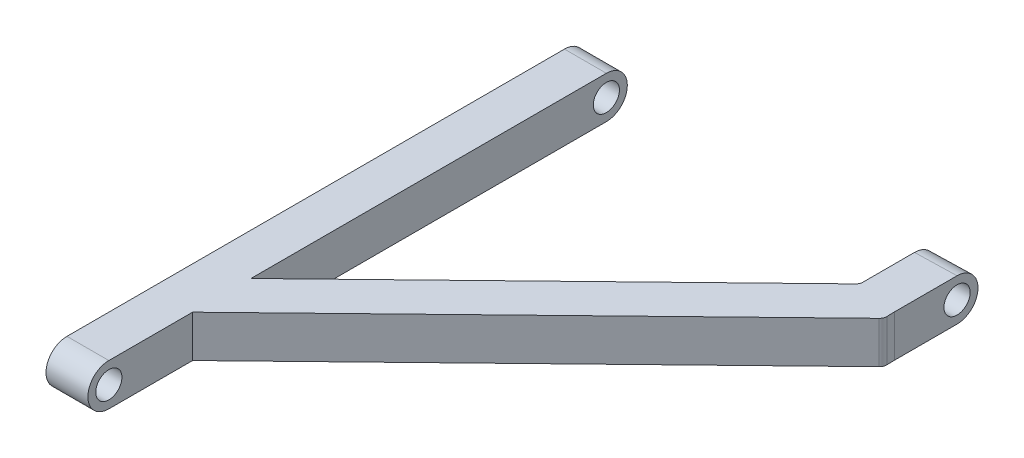
ISO-10303-21;
HEADER;
FILE_DESCRIPTION(('STEP AP214'),'2;1');
FILE_NAME('part.step','',(''),(''),'','','');
FILE_SCHEMA(('AUTOMOTIVE_DESIGN { 1 0 10303 214 1 1 1 1 }'));
ENDSEC;
DATA;
#1=APPLICATION_CONTEXT('core data for automotive mechanical design processes');
#2=APPLICATION_PROTOCOL_DEFINITION('international standard','automotive_design',2000,#1);
#3=PRODUCT_CONTEXT('',#1,'mechanical');
#4=PRODUCT('Part','Part','',(#3));
#5=PRODUCT_RELATED_PRODUCT_CATEGORY('part','',(#4));
#6=PRODUCT_DEFINITION_FORMATION('','',#4);
#7=PRODUCT_DEFINITION_CONTEXT('part definition',#1,'design');
#8=PRODUCT_DEFINITION('design','',#6,#7);
#9=PRODUCT_DEFINITION_SHAPE('','',#8);
#10=(LENGTH_UNIT() NAMED_UNIT(*) SI_UNIT(.MILLI.,.METRE.));
#11=(NAMED_UNIT(*) PLANE_ANGLE_UNIT() SI_UNIT($,.RADIAN.));
#12=(NAMED_UNIT(*) SI_UNIT($,.STERADIAN.) SOLID_ANGLE_UNIT());
#13=UNCERTAINTY_MEASURE_WITH_UNIT(LENGTH_MEASURE(1.E-05),#10,'distance_accuracy_value','');
#14=(GEOMETRIC_REPRESENTATION_CONTEXT(3) GLOBAL_UNCERTAINTY_ASSIGNED_CONTEXT((#13)) GLOBAL_UNIT_ASSIGNED_CONTEXT((#10,
#11,#12)) REPRESENTATION_CONTEXT('',''));
#15=CARTESIAN_POINT('',(0.,0.,0.));
#16=DIRECTION('',(0.,0.,1.));
#17=DIRECTION('',(1.,0.,0.));
#18=AXIS2_PLACEMENT_3D('',#15,#16,#17);
#19=CARTESIAN_POINT('',(335.193923386663,-20.0000000000004,-462.022456718937));
#20=DIRECTION('',(-1.,0.,0.));
#21=DIRECTION('',(0.,0.,1.));
#22=AXIS2_PLACEMENT_3D('',#19,#20,#21);
#23=PLANE('',#22);
#24=DIRECTION('',(0.,0.,1.));
#25=VECTOR('',#24,1.);
#26=CARTESIAN_POINT('',(335.193923386663,19.9999999999996,-462.022456718937));
#27=LINE('',#26,#25);
#28=CARTESIAN_POINT('',(335.193923386663,19.9999999999997,-473.985718581626));
#29=VERTEX_POINT('',#28);
#30=CARTESIAN_POINT('',(335.193923386663,19.9999999999997,-424.789203993548));
#31=VERTEX_POINT('',#30);
#32=EDGE_CURVE('E190',#29,#31,#27,.T.);
#33=ORIENTED_EDGE('',*,*,#32,.F.);
#34=CARTESIAN_POINT('',(335.193923386663,-3.38538015855128E-13,-473.985718581626));
#35=DIRECTION('',(-1.,0.,0.));
#36=DIRECTION('',(0.,0.,1.));
#37=AXIS2_PLACEMENT_3D('',#34,#35,#36);
#38=ELLIPSE('',#37,20.006471869853,20.);
#39=CARTESIAN_POINT('',(335.193923386663,-20.0000000000004,-473.985718581626));
#40=VERTEX_POINT('',#39);
#41=EDGE_CURVE('E177',#29,#40,#38,.T.);
#42=ORIENTED_EDGE('',*,*,#41,.T.);
#43=DIRECTION('',(0.,0.,1.));
#44=VECTOR('',#43,1.);
#45=CARTESIAN_POINT('',(335.193923386663,-20.0000000000004,-495.));
#46=LINE('',#45,#44);
#47=CARTESIAN_POINT('',(335.193923386663,-20.0000000000003,-424.789203993548));
#48=VERTEX_POINT('',#47);
#49=EDGE_CURVE('E336',#40,#48,#46,.T.);
#50=ORIENTED_EDGE('',*,*,#49,.T.);
#51=DIRECTION('',(0.,1.,0.));
#52=VECTOR('',#51,1.);
#53=CARTESIAN_POINT('',(335.193923386663,-20.0000000000003,-424.789203993548));
#54=LINE('',#53,#52);
#55=EDGE_CURVE('E199',#48,#31,#54,.T.);
#56=ORIENTED_EDGE('',*,*,#55,.T.);
#57=EDGE_LOOP('',(#33,#42,#50,#56));
#58=FACE_BOUND('',#57,.T.);
#59=CARTESIAN_POINT('',(335.193923386663,-3.38538015855128E-13,-473.985718581626));
#60=DIRECTION('',(-1.,0.,0.));
#61=DIRECTION('',(0.,0.,1.));
#62=AXIS2_PLACEMENT_3D('',#59,#60,#61);
#63=ELLIPSE('',#62,12.5040449186581,12.5);
#64=CARTESIAN_POINT('',(335.193923386663,-3.3195324311871E-13,-461.481673662968));
#65=VERTEX_POINT('',#64);
#66=EDGE_CURVE('E349',#65,#65,#63,.F.);
#67=ORIENTED_EDGE('',*,*,#66,.T.);
#68=EDGE_LOOP('',(#67));
#69=FACE_BOUND('',#68,.T.);
#70=ADVANCED_FACE('F83',(#58,#69),#23,.T.);
#71=CARTESIAN_POINT('',(374.806076613337,-20.0000000000004,-495.));
#72=DIRECTION('',(1.,0.,0.));
#73=DIRECTION('',(0.,0.,-1.));
#74=AXIS2_PLACEMENT_3D('',#71,#72,#73);
#75=PLANE('',#74);
#76=DIRECTION('',(0.,0.,-1.));
#77=VECTOR('',#76,1.);
#78=CARTESIAN_POINT('',(374.806076613337,-20.0000000000004,-495.));
#79=LINE('',#78,#77);
#80=CARTESIAN_POINT('',(374.806076613337,-20.0000000000003,-415.181628683137));
#81=VERTEX_POINT('',#80);
#82=CARTESIAN_POINT('',(374.806076613337,-20.0000000000004,-474.993528130147));
#83=VERTEX_POINT('',#82);
#84=EDGE_CURVE('E339',#81,#83,#79,.T.);
#85=ORIENTED_EDGE('',*,*,#84,.T.);
#86=CARTESIAN_POINT('',(374.806076613337,-3.39068739863381E-13,-474.993528130147));
#87=DIRECTION('',(1.,0.,0.));
#88=DIRECTION('',(0.,0.,1.));
#89=AXIS2_PLACEMENT_3D('',#86,#87,#88);
#90=ELLIPSE('',#89,20.006471869853,20.);
#91=CARTESIAN_POINT('',(374.806076613337,19.9999999999996,-474.993528130147));
#92=VERTEX_POINT('',#91);
#93=EDGE_CURVE('E12',#83,#92,#90,.T.);
#94=ORIENTED_EDGE('',*,*,#93,.T.);
#95=DIRECTION('',(0.,0.,-1.));
#96=VECTOR('',#95,1.);
#97=CARTESIAN_POINT('',(374.806076613337,19.9999999999996,-495.));
#98=LINE('',#97,#96);
#99=CARTESIAN_POINT('',(374.806076613337,19.9999999999997,-415.181628683137));
#100=VERTEX_POINT('',#99);
#101=EDGE_CURVE('E194',#100,#92,#98,.T.);
#102=ORIENTED_EDGE('',*,*,#101,.F.);
#103=DIRECTION('',(0.,1.,0.));
#104=VECTOR('',#103,1.);
#105=CARTESIAN_POINT('',(374.806076613337,-20.0000000000003,-415.181628683137));
#106=LINE('',#105,#104);
#107=EDGE_CURVE('E233',#81,#100,#106,.T.);
#108=ORIENTED_EDGE('',*,*,#107,.F.);
#109=EDGE_LOOP('',(#85,#94,#102,#108));
#110=FACE_BOUND('',#109,.T.);
#111=CARTESIAN_POINT('',(374.806076613337,-3.39068739863381E-13,-474.993528130147));
#112=DIRECTION('',(1.,0.,0.));
#113=DIRECTION('',(0.,0.,1.));
#114=AXIS2_PLACEMENT_3D('',#111,#112,#113);
#115=ELLIPSE('',#114,12.5040449186581,12.5);
#116=CARTESIAN_POINT('',(374.806076613337,-3.32483967126962E-13,-462.489483211489));
#117=VERTEX_POINT('',#116);
#118=EDGE_CURVE('E87',#117,#117,#115,.F.);
#119=ORIENTED_EDGE('',*,*,#118,.T.);
#120=EDGE_LOOP('',(#119));
#121=FACE_BOUND('',#120,.T.);
#122=ADVANCED_FACE('F361',(#110,#121),#75,.T.);
#123=CARTESIAN_POINT('',(40.,0.,0.));
#124=DIRECTION('',(1.,0.,0.));
#125=DIRECTION('',(0.,0.,-1.));
#126=AXIS2_PLACEMENT_3D('',#123,#124,#125);
#127=PLANE('',#126);
#128=CARTESIAN_POINT('',(40.,0.,0.));
#129=DIRECTION('',(1.,0.,0.));
#130=DIRECTION('',(0.,0.,-1.));
#131=AXIS2_PLACEMENT_3D('',#128,#129,#130);
#132=CIRCLE('',#131,12.5);
#133=CARTESIAN_POINT('',(40.,0.,-12.5));
#134=VERTEX_POINT('',#133);
#135=EDGE_CURVE('E254',#134,#134,#132,.T.);
#136=ORIENTED_EDGE('',*,*,#135,.F.);
#137=EDGE_LOOP('',(#136));
#138=FACE_BOUND('',#137,.T.);
#139=DIRECTION('',(0.,0.,1.));
#140=VECTOR('',#139,1.);
#141=CARTESIAN_POINT('',(40.,-19.9999999999999,0.));
#142=LINE('',#141,#140);
#143=CARTESIAN_POINT('',(40.,-20.0000000000002,-80.));
#144=VERTEX_POINT('',#143);
#145=CARTESIAN_POINT('',(40.,-20.,0.));
#146=VERTEX_POINT('',#145);
#147=EDGE_CURVE('E245',#144,#146,#142,.T.);
#148=ORIENTED_EDGE('',*,*,#147,.F.);
#149=DIRECTION('',(0.,1.,0.));
#150=VECTOR('',#149,1.);
#151=CARTESIAN_POINT('',(40.,-20.0000000000002,-80.));
#152=LINE('',#151,#150);
#153=CARTESIAN_POINT('',(40.,19.9999999999999,-80.));
#154=VERTEX_POINT('',#153);
#155=EDGE_CURVE('E222',#144,#154,#152,.T.);
#156=ORIENTED_EDGE('',*,*,#155,.T.);
#157=DIRECTION('',(0.,0.,1.));
#158=VECTOR('',#157,1.);
#159=CARTESIAN_POINT('',(40.,19.9999999999999,0.));
#160=LINE('',#159,#158);
#161=CARTESIAN_POINT('',(40.,20.,0.));
#162=VERTEX_POINT('',#161);
#163=EDGE_CURVE('E244',#154,#162,#160,.T.);
#164=ORIENTED_EDGE('',*,*,#163,.T.);
#165=CARTESIAN_POINT('',(40.,0.,0.));
#166=DIRECTION('',(1.,0.,0.));
#167=DIRECTION('',(0.,0.,-1.));
#168=AXIS2_PLACEMENT_3D('',#165,#166,#167);
#169=CIRCLE('',#168,20.);
#170=EDGE_CURVE('E250',#162,#146,#169,.T.);
#171=ORIENTED_EDGE('',*,*,#170,.T.);
#172=EDGE_LOOP('',(#148,#156,#164,#171));
#173=FACE_BOUND('',#172,.T.);
#174=ADVANCED_FACE('F379',(#138,#173),#127,.T.);
#175=CARTESIAN_POINT('',(40.,-19.9999999999999,0.));
#176=DIRECTION('',(0.,-1.,0.));
#177=DIRECTION('',(0.,0.,-1.));
#178=AXIS2_PLACEMENT_3D('',#175,#176,#177);
#179=PLANE('',#178);
#180=DIRECTION('',(-0.999676511186225,0.,0.0254336977755314));
#181=VECTOR('',#180,1.);
#182=CARTESIAN_POINT('',(418.270773946204,-20.0000000000003,-476.099353828259));
#183=LINE('',#182,#181);
#184=EDGE_CURVE('E180',#83,#40,#183,.T.);
#185=ORIENTED_EDGE('',*,*,#184,.F.);
#186=ORIENTED_EDGE('',*,*,#84,.F.);
#187=DIRECTION('',(-0.0254336977755314,0.,-0.999676511186225));
#188=VECTOR('',#187,1.);
#189=CARTESIAN_POINT('',(374.806076613337,-20.0000000000003,-415.181628683137));
#190=LINE('',#189,#188);
#191=CARTESIAN_POINT('',(374.992889327505,-20.0000000000003,-407.838918079536));
#192=VERTEX_POINT('',#191);
#193=EDGE_CURVE('E357',#192,#81,#190,.T.);
#194=ORIENTED_EDGE('',*,*,#193,.F.);
#195=CARTESIAN_POINT('',(368.014348913388,-20.0000000000003,-407.661370557092));
#196=DIRECTION('',(0.,1.,0.));
#197=DIRECTION('',(0.,0.,1.));
#198=AXIS2_PLACEMENT_3D('',#195,#196,#197);
#199=CIRCLE('',#198,6.98079862438376);
#200=CARTESIAN_POINT('',(372.872939005298,-20.0000000000003,-402.648821130602));
#201=VERTEX_POINT('',#200);
#202=EDGE_CURVE('E217',#201,#192,#199,.T.);
#203=ORIENTED_EDGE('',*,*,#202,.F.);
#204=DIRECTION('',(0.718048134060329,0.,-0.695993446213741));
#205=VECTOR('',#204,1.);
#206=CARTESIAN_POINT('',(40.,-20.0000000000002,-80.));
#207=LINE('',#206,#205);
#208=EDGE_CURVE('E239',#144,#201,#207,.T.);
#209=ORIENTED_EDGE('',*,*,#208,.F.);
#210=ORIENTED_EDGE('',*,*,#147,.T.);
#211=DIRECTION('',(-1.,0.,0.));
#212=VECTOR('',#211,1.);
#213=CARTESIAN_POINT('',(40.,-20.,0.));
#214=LINE('',#213,#212);
#215=CARTESIAN_POINT('',(0.,-20.,0.));
#216=VERTEX_POINT('',#215);
#217=EDGE_CURVE('E258',#146,#216,#214,.T.);
#218=ORIENTED_EDGE('',*,*,#217,.T.);
#219=DIRECTION('',(0.,0.,1.));
#220=VECTOR('',#219,1.);
#221=CARTESIAN_POINT('',(0.,-19.9999999999999,0.));
#222=LINE('',#221,#220);
#223=CARTESIAN_POINT('',(0.,-20.,-475.));
#224=VERTEX_POINT('',#223);
#225=EDGE_CURVE('E259',#224,#216,#222,.T.);
#226=ORIENTED_EDGE('',*,*,#225,.F.);
#227=DIRECTION('',(-1.,0.,0.));
#228=VECTOR('',#227,1.);
#229=CARTESIAN_POINT('',(40.,-20.,-475.));
#230=LINE('',#229,#228);
#231=CARTESIAN_POINT('',(40.,-20.,-475.));
#232=VERTEX_POINT('',#231);
#233=EDGE_CURVE('E93',#232,#224,#230,.T.);
#234=ORIENTED_EDGE('',*,*,#233,.F.);
#235=CARTESIAN_POINT('',(40.,-20.0000000000002,-135.706571889287));
#236=VERTEX_POINT('',#235);
#237=EDGE_CURVE('E240',#232,#236,#142,.T.);
#238=ORIENTED_EDGE('',*,*,#237,.T.);
#239=DIRECTION('',(-0.718048134060329,0.,0.695993446213741));
#240=VECTOR('',#239,1.);
#241=CARTESIAN_POINT('',(40.,-20.0000000000002,-135.706571889287));
#242=LINE('',#241,#240);
#243=CARTESIAN_POINT('',(333.071714854189,-20.0000000000003,-419.776654567059));
#244=VERTEX_POINT('',#243);
#245=EDGE_CURVE('E326',#244,#236,#242,.T.);
#246=ORIENTED_EDGE('',*,*,#245,.F.);
#247=CARTESIAN_POINT('',(328.21312476228,-20.0000000000003,-424.789203993548));
#248=DIRECTION('',(0.,-1.,0.));
#249=DIRECTION('',(0.,0.,1.));
#250=AXIS2_PLACEMENT_3D('',#247,#248,#249);
#251=CIRCLE('',#250,6.9807986243832);
#252=EDGE_CURVE('E328',#48,#244,#251,.T.);
#253=ORIENTED_EDGE('',*,*,#252,.F.);
#254=ORIENTED_EDGE('',*,*,#49,.F.);
#255=EDGE_LOOP('',(#185,#186,#194,#203,#209,#210,#218,#226,#234,#238,#246,#253,#254));
#256=FACE_BOUND('',#255,.T.);
#257=ADVANCED_FACE('F308',(#256),#179,.T.);
#258=CARTESIAN_POINT('',(40.,19.9999999999999,0.));
#259=DIRECTION('',(0.,-1.,0.));
#260=DIRECTION('',(0.,0.,-1.));
#261=AXIS2_PLACEMENT_3D('',#258,#259,#260);
#262=PLANE('',#261);
#263=ORIENTED_EDGE('',*,*,#101,.T.);
#264=DIRECTION('',(-0.999676511186225,0.,0.0254336977755314));
#265=VECTOR('',#264,1.);
#266=CARTESIAN_POINT('',(418.270773946204,19.9999999999997,-476.099353828259));
#267=LINE('',#266,#265);
#268=EDGE_CURVE('E100',#92,#29,#267,.T.);
#269=ORIENTED_EDGE('',*,*,#268,.T.);
#270=ORIENTED_EDGE('',*,*,#32,.T.);
#271=CARTESIAN_POINT('',(328.21312476228,19.9999999999997,-424.789203993548));
#272=DIRECTION('',(0.,-1.,0.));
#273=DIRECTION('',(0.,0.,1.));
#274=AXIS2_PLACEMENT_3D('',#271,#272,#273);
#275=CIRCLE('',#274,6.9807986243832);
#276=CARTESIAN_POINT('',(333.071714854189,19.9999999999997,-419.776654567059));
#277=VERTEX_POINT('',#276);
#278=EDGE_CURVE('E202',#31,#277,#275,.T.);
#279=ORIENTED_EDGE('',*,*,#278,.T.);
#280=DIRECTION('',(-0.718048134060329,0.,0.695993446213741));
#281=VECTOR('',#280,1.);
#282=CARTESIAN_POINT('',(40.,19.9999999999998,-135.706571889287));
#283=LINE('',#282,#281);
#284=CARTESIAN_POINT('',(40.,19.9999999999998,-135.706571889287));
#285=VERTEX_POINT('',#284);
#286=EDGE_CURVE('E206',#277,#285,#283,.T.);
#287=ORIENTED_EDGE('',*,*,#286,.T.);
#288=CARTESIAN_POINT('',(40.,20.,-475.));
#289=VERTEX_POINT('',#288);
#290=EDGE_CURVE('E246',#289,#285,#160,.T.);
#291=ORIENTED_EDGE('',*,*,#290,.F.);
#292=DIRECTION('',(-1.,0.,0.));
#293=VECTOR('',#292,1.);
#294=CARTESIAN_POINT('',(40.,20.,-475.));
#295=LINE('',#294,#293);
#296=CARTESIAN_POINT('',(0.,20.,-475.));
#297=VERTEX_POINT('',#296);
#298=EDGE_CURVE('E281',#289,#297,#295,.T.);
#299=ORIENTED_EDGE('',*,*,#298,.T.);
#300=DIRECTION('',(0.,0.,1.));
#301=VECTOR('',#300,1.);
#302=CARTESIAN_POINT('',(0.,19.9999999999999,0.));
#303=LINE('',#302,#301);
#304=CARTESIAN_POINT('',(0.,20.,0.));
#305=VERTEX_POINT('',#304);
#306=EDGE_CURVE('E263',#297,#305,#303,.T.);
#307=ORIENTED_EDGE('',*,*,#306,.T.);
#308=DIRECTION('',(-1.,0.,0.));
#309=VECTOR('',#308,1.);
#310=CARTESIAN_POINT('',(40.,20.,0.));
#311=LINE('',#310,#309);
#312=EDGE_CURVE('E277',#162,#305,#311,.T.);
#313=ORIENTED_EDGE('',*,*,#312,.F.);
#314=ORIENTED_EDGE('',*,*,#163,.F.);
#315=DIRECTION('',(0.718048134060329,0.,-0.695993446213741));
#316=VECTOR('',#315,1.);
#317=CARTESIAN_POINT('',(40.,19.9999999999998,-80.));
#318=LINE('',#317,#316);
#319=CARTESIAN_POINT('',(372.872939005298,19.9999999999997,-402.648821130602));
#320=VERTEX_POINT('',#319);
#321=EDGE_CURVE('E107',#154,#320,#318,.T.);
#322=ORIENTED_EDGE('',*,*,#321,.T.);
#323=CARTESIAN_POINT('',(368.014348913388,19.9999999999997,-407.661370557092));
#324=DIRECTION('',(0.,1.,0.));
#325=DIRECTION('',(0.,0.,1.));
#326=AXIS2_PLACEMENT_3D('',#323,#324,#325);
#327=CIRCLE('',#326,6.98079862438376);
#328=CARTESIAN_POINT('',(374.992889327505,19.9999999999997,-407.838918079536));
#329=VERTEX_POINT('',#328);
#330=EDGE_CURVE('E346',#320,#329,#327,.T.);
#331=ORIENTED_EDGE('',*,*,#330,.T.);
#332=DIRECTION('',(-0.0254336977755314,0.,-0.999676511186225));
#333=VECTOR('',#332,1.);
#334=CARTESIAN_POINT('',(374.806076613337,19.9999999999997,-415.181628683137));
#335=LINE('',#334,#333);
#336=EDGE_CURVE('E208',#329,#100,#335,.T.);
#337=ORIENTED_EDGE('',*,*,#336,.T.);
#338=EDGE_LOOP('',(#263,#269,#270,#279,#287,#291,#299,#307,#313,#314,#322,#331,#337));
#339=FACE_BOUND('',#338,.T.);
#340=ADVANCED_FACE('F188',(#339),#262,.F.);
#341=CARTESIAN_POINT('',(40.,0.,0.));
#342=DIRECTION('',(-1.,0.,0.));
#343=DIRECTION('',(0.,0.,1.));
#344=AXIS2_PLACEMENT_3D('',#341,#342,#343);
#345=CYLINDRICAL_SURFACE('',#344,20.);
#346=CARTESIAN_POINT('',(0.,0.,0.));
#347=DIRECTION('',(1.,0.,0.));
#348=DIRECTION('',(0.,0.,-1.));
#349=AXIS2_PLACEMENT_3D('',#346,#347,#348);
#350=CIRCLE('',#349,20.);
#351=EDGE_CURVE('E267',#305,#216,#350,.T.);
#352=ORIENTED_EDGE('',*,*,#351,.T.);
#353=ORIENTED_EDGE('',*,*,#217,.F.);
#354=ORIENTED_EDGE('',*,*,#170,.F.);
#355=ORIENTED_EDGE('',*,*,#312,.T.);
#356=EDGE_LOOP('',(#352,#353,#354,#355));
#357=FACE_BOUND('',#356,.T.);
#358=ADVANCED_FACE('F314',(#357),#345,.T.);
#359=CARTESIAN_POINT('',(40.,0.,0.));
#360=DIRECTION('',(-1.,0.,0.));
#361=DIRECTION('',(0.,0.,1.));
#362=AXIS2_PLACEMENT_3D('',#359,#360,#361);
#363=CYLINDRICAL_SURFACE('',#362,12.5);
#364=ORIENTED_EDGE('',*,*,#135,.T.);
#365=EDGE_LOOP('',(#364));
#366=FACE_BOUND('',#365,.T.);
#367=CARTESIAN_POINT('',(0.,0.,0.));
#368=DIRECTION('',(1.,0.,0.));
#369=DIRECTION('',(0.,0.,-1.));
#370=AXIS2_PLACEMENT_3D('',#367,#368,#369);
#371=CIRCLE('',#370,12.5);
#372=CARTESIAN_POINT('',(0.,0.,-12.5));
#373=VERTEX_POINT('',#372);
#374=EDGE_CURVE('E271',#373,#373,#371,.T.);
#375=ORIENTED_EDGE('',*,*,#374,.F.);
#376=EDGE_LOOP('',(#375));
#377=FACE_BOUND('',#376,.T.);
#378=ADVANCED_FACE('F397',(#366,#377),#363,.F.);
#379=DIRECTION('',(0.,1.,0.));
#380=VECTOR('',#379,1.);
#381=CARTESIAN_POINT('',(40.,-20.0000000000002,-135.706571889287));
#382=LINE('',#381,#380);
#383=EDGE_CURVE('E225',#236,#285,#382,.T.);
#384=ORIENTED_EDGE('',*,*,#383,.F.);
#385=ORIENTED_EDGE('',*,*,#237,.F.);
#386=CARTESIAN_POINT('',(40.,-1.11022302462516E-13,-475.));
#387=DIRECTION('',(-1.,0.,0.));
#388=DIRECTION('',(0.,0.,1.));
#389=AXIS2_PLACEMENT_3D('',#386,#387,#388);
#390=CIRCLE('',#389,20.);
#391=EDGE_CURVE('E264',#289,#232,#390,.T.);
#392=ORIENTED_EDGE('',*,*,#391,.F.);
#393=ORIENTED_EDGE('',*,*,#290,.T.);
#394=EDGE_LOOP('',(#384,#385,#392,#393));
#395=FACE_BOUND('',#394,.T.);
#396=CARTESIAN_POINT('',(40.,-1.11022302462516E-13,-475.));
#397=DIRECTION('',(-1.,0.,0.));
#398=DIRECTION('',(0.,0.,1.));
#399=AXIS2_PLACEMENT_3D('',#396,#397,#398);
#400=CIRCLE('',#399,12.5);
#401=CARTESIAN_POINT('',(40.,-1.11022302462516E-13,-462.5));
#402=VERTEX_POINT('',#401);
#403=EDGE_CURVE('E286',#402,#402,#400,.T.);
#404=ORIENTED_EDGE('',*,*,#403,.T.);
#405=EDGE_LOOP('',(#404));
#406=FACE_BOUND('',#405,.T.);
#407=ADVANCED_FACE('F322',(#395,#406),#127,.T.);
#408=CARTESIAN_POINT('',(0.,0.,0.));
#409=DIRECTION('',(1.,0.,0.));
#410=DIRECTION('',(0.,0.,-1.));
#411=AXIS2_PLACEMENT_3D('',#408,#409,#410);
#412=PLANE('',#411);
#413=ORIENTED_EDGE('',*,*,#225,.T.);
#414=ORIENTED_EDGE('',*,*,#351,.F.);
#415=ORIENTED_EDGE('',*,*,#306,.F.);
#416=CARTESIAN_POINT('',(0.,-1.11022302462516E-13,-475.));
#417=DIRECTION('',(-1.,0.,0.));
#418=DIRECTION('',(0.,0.,1.));
#419=AXIS2_PLACEMENT_3D('',#416,#417,#418);
#420=CIRCLE('',#419,20.);
#421=EDGE_CURVE('E290',#297,#224,#420,.T.);
#422=ORIENTED_EDGE('',*,*,#421,.T.);
#423=EDGE_LOOP('',(#413,#414,#415,#422));
#424=FACE_BOUND('',#423,.T.);
#425=ORIENTED_EDGE('',*,*,#374,.T.);
#426=EDGE_LOOP('',(#425));
#427=FACE_BOUND('',#426,.T.);
#428=CARTESIAN_POINT('',(0.,-1.11022302462516E-13,-475.));
#429=DIRECTION('',(-1.,0.,0.));
#430=DIRECTION('',(0.,0.,1.));
#431=AXIS2_PLACEMENT_3D('',#428,#429,#430);
#432=CIRCLE('',#431,12.5);
#433=CARTESIAN_POINT('',(0.,-1.11022302462516E-13,-462.5));
#434=VERTEX_POINT('',#433);
#435=EDGE_CURVE('E221',#434,#434,#432,.T.);
#436=ORIENTED_EDGE('',*,*,#435,.F.);
#437=EDGE_LOOP('',(#436));
#438=FACE_BOUND('',#437,.T.);
#439=ADVANCED_FACE('F303',(#424,#427,#438),#412,.F.);
#440=CARTESIAN_POINT('',(40.,-1.11022302462516E-13,-475.));
#441=DIRECTION('',(-1.,0.,0.));
#442=DIRECTION('',(0.,0.,1.));
#443=AXIS2_PLACEMENT_3D('',#440,#441,#442);
#444=CYLINDRICAL_SURFACE('',#443,20.);
#445=ORIENTED_EDGE('',*,*,#391,.T.);
#446=ORIENTED_EDGE('',*,*,#233,.T.);
#447=ORIENTED_EDGE('',*,*,#421,.F.);
#448=ORIENTED_EDGE('',*,*,#298,.F.);
#449=EDGE_LOOP('',(#445,#446,#447,#448));
#450=FACE_BOUND('',#449,.T.);
#451=ADVANCED_FACE('F85',(#450),#444,.T.);
#452=CARTESIAN_POINT('',(40.,-1.11022302462516E-13,-475.));
#453=DIRECTION('',(-1.,0.,0.));
#454=DIRECTION('',(0.,0.,1.));
#455=AXIS2_PLACEMENT_3D('',#452,#453,#454);
#456=CYLINDRICAL_SURFACE('',#455,12.5);
#457=ORIENTED_EDGE('',*,*,#403,.F.);
#458=EDGE_LOOP('',(#457));
#459=FACE_BOUND('',#458,.T.);
#460=ORIENTED_EDGE('',*,*,#435,.T.);
#461=EDGE_LOOP('',(#460));
#462=FACE_BOUND('',#461,.T.);
#463=ADVANCED_FACE('F391',(#459,#462),#456,.F.);
#464=CARTESIAN_POINT('',(368.014348913388,-20.0000000000003,-407.661370557092));
#465=DIRECTION('',(0.,1.,0.));
#466=DIRECTION('',(0.,0.,1.));
#467=AXIS2_PLACEMENT_3D('',#464,#465,#466);
#468=CYLINDRICAL_SURFACE('',#467,6.98079862438376);
#469=ORIENTED_EDGE('',*,*,#330,.F.);
#470=DIRECTION('',(0.,1.,0.));
#471=VECTOR('',#470,1.);
#472=CARTESIAN_POINT('',(372.872939005298,-20.0000000000003,-402.648821130602));
#473=LINE('',#472,#471);
#474=EDGE_CURVE('E218',#201,#320,#473,.T.);
#475=ORIENTED_EDGE('',*,*,#474,.F.);
#476=ORIENTED_EDGE('',*,*,#202,.T.);
#477=DIRECTION('',(0.,1.,0.));
#478=VECTOR('',#477,1.);
#479=CARTESIAN_POINT('',(374.992889327505,-20.0000000000003,-407.838918079536));
#480=LINE('',#479,#478);
#481=EDGE_CURVE('E236',#192,#329,#480,.T.);
#482=ORIENTED_EDGE('',*,*,#481,.T.);
#483=EDGE_LOOP('',(#469,#475,#476,#482));
#484=FACE_BOUND('',#483,.T.);
#485=ADVANCED_FACE('F376',(#484),#468,.T.);
#486=CARTESIAN_POINT('',(40.,-20.0000000000002,-80.));
#487=DIRECTION('',(0.695993446213741,0.,0.718048134060329));
#488=DIRECTION('',(0.718048134060329,0.,-0.695993446213741));
#489=AXIS2_PLACEMENT_3D('',#486,#487,#488);
#490=PLANE('',#489);
#491=ORIENTED_EDGE('',*,*,#321,.F.);
#492=ORIENTED_EDGE('',*,*,#155,.F.);
#493=ORIENTED_EDGE('',*,*,#208,.T.);
#494=ORIENTED_EDGE('',*,*,#474,.T.);
#495=EDGE_LOOP('',(#491,#492,#493,#494));
#496=FACE_BOUND('',#495,.T.);
#497=ADVANCED_FACE('F377',(#496),#490,.T.);
#498=CARTESIAN_POINT('',(40.,-20.0000000000002,-135.706571889287));
#499=DIRECTION('',(-0.695993446213741,0.,-0.718048134060329));
#500=DIRECTION('',(-0.718048134060329,0.,0.695993446213741));
#501=AXIS2_PLACEMENT_3D('',#498,#499,#500);
#502=PLANE('',#501);
#503=ORIENTED_EDGE('',*,*,#286,.F.);
#504=DIRECTION('',(0.,1.,0.));
#505=VECTOR('',#504,1.);
#506=CARTESIAN_POINT('',(333.071714854189,-20.0000000000003,-419.776654567059));
#507=LINE('',#506,#505);
#508=EDGE_CURVE('E228',#244,#277,#507,.T.);
#509=ORIENTED_EDGE('',*,*,#508,.F.);
#510=ORIENTED_EDGE('',*,*,#245,.T.);
#511=ORIENTED_EDGE('',*,*,#383,.T.);
#512=EDGE_LOOP('',(#503,#509,#510,#511));
#513=FACE_BOUND('',#512,.T.);
#514=ADVANCED_FACE('F411',(#513),#502,.T.);
#515=CARTESIAN_POINT('',(328.21312476228,-20.0000000000003,-424.789203993548));
#516=DIRECTION('',(0.,1.,0.));
#517=DIRECTION('',(0.,0.,1.));
#518=AXIS2_PLACEMENT_3D('',#515,#516,#517);
#519=CYLINDRICAL_SURFACE('',#518,6.9807986243832);
#520=ORIENTED_EDGE('',*,*,#278,.F.);
#521=ORIENTED_EDGE('',*,*,#55,.F.);
#522=ORIENTED_EDGE('',*,*,#252,.T.);
#523=ORIENTED_EDGE('',*,*,#508,.T.);
#524=EDGE_LOOP('',(#520,#521,#522,#523));
#525=FACE_BOUND('',#524,.T.);
#526=ADVANCED_FACE('F333',(#525),#519,.F.);
#527=CARTESIAN_POINT('',(374.806076613337,-20.0000000000003,-415.181628683137));
#528=DIRECTION('',(0.999676511186225,0.,-0.0254336977755314));
#529=DIRECTION('',(-0.0254336977755314,0.,-0.999676511186225));
#530=AXIS2_PLACEMENT_3D('',#527,#528,#529);
#531=PLANE('',#530);
#532=ORIENTED_EDGE('',*,*,#336,.F.);
#533=ORIENTED_EDGE('',*,*,#481,.F.);
#534=ORIENTED_EDGE('',*,*,#193,.T.);
#535=ORIENTED_EDGE('',*,*,#107,.T.);
#536=EDGE_LOOP('',(#532,#533,#534,#535));
#537=FACE_BOUND('',#536,.T.);
#538=ADVANCED_FACE('F354',(#537),#531,.T.);
#539=CARTESIAN_POINT('',(418.270773946204,-3.3965108029446E-13,-476.099353828259));
#540=DIRECTION('',(-0.999676511186225,0.,0.0254336977755314));
#541=DIRECTION('',(0.0254336977755314,0.,0.999676511186225));
#542=AXIS2_PLACEMENT_3D('',#539,#540,#541);
#543=CYLINDRICAL_SURFACE('',#542,20.);
#544=ORIENTED_EDGE('',*,*,#268,.F.);
#545=ORIENTED_EDGE('',*,*,#93,.F.);
#546=ORIENTED_EDGE('',*,*,#184,.T.);
#547=ORIENTED_EDGE('',*,*,#41,.F.);
#548=EDGE_LOOP('',(#544,#545,#546,#547));
#549=FACE_BOUND('',#548,.T.);
#550=ADVANCED_FACE('F178',(#549),#543,.T.);
#551=CARTESIAN_POINT('',(418.270773946204,-3.3965108029446E-13,-476.099353828259));
#552=DIRECTION('',(-0.999676511186225,0.,0.0254336977755314));
#553=DIRECTION('',(0.0254336977755314,0.,0.999676511186225));
#554=AXIS2_PLACEMENT_3D('',#551,#552,#553);
#555=CYLINDRICAL_SURFACE('',#554,12.5);
#556=ORIENTED_EDGE('',*,*,#66,.F.);
#557=EDGE_LOOP('',(#556));
#558=FACE_BOUND('',#557,.T.);
#559=ORIENTED_EDGE('',*,*,#118,.F.);
#560=EDGE_LOOP('',(#559));
#561=FACE_BOUND('',#560,.T.);
#562=ADVANCED_FACE('F435',(#558,#561),#555,.F.);
#563=CLOSED_SHELL('',(#70,#122,#174,#257,#340,#358,#378,#407,#439,#451,#463,#485,#497,#514,#526,
#538,#550,#562));
#564=MANIFOLD_SOLID_BREP('B2',#563);
#565=ADVANCED_BREP_SHAPE_REPRESENTATION('',(#18,#564),#14);
#566=SHAPE_DEFINITION_REPRESENTATION(#9,#565);
ENDSEC;
END-ISO-10303-21;
